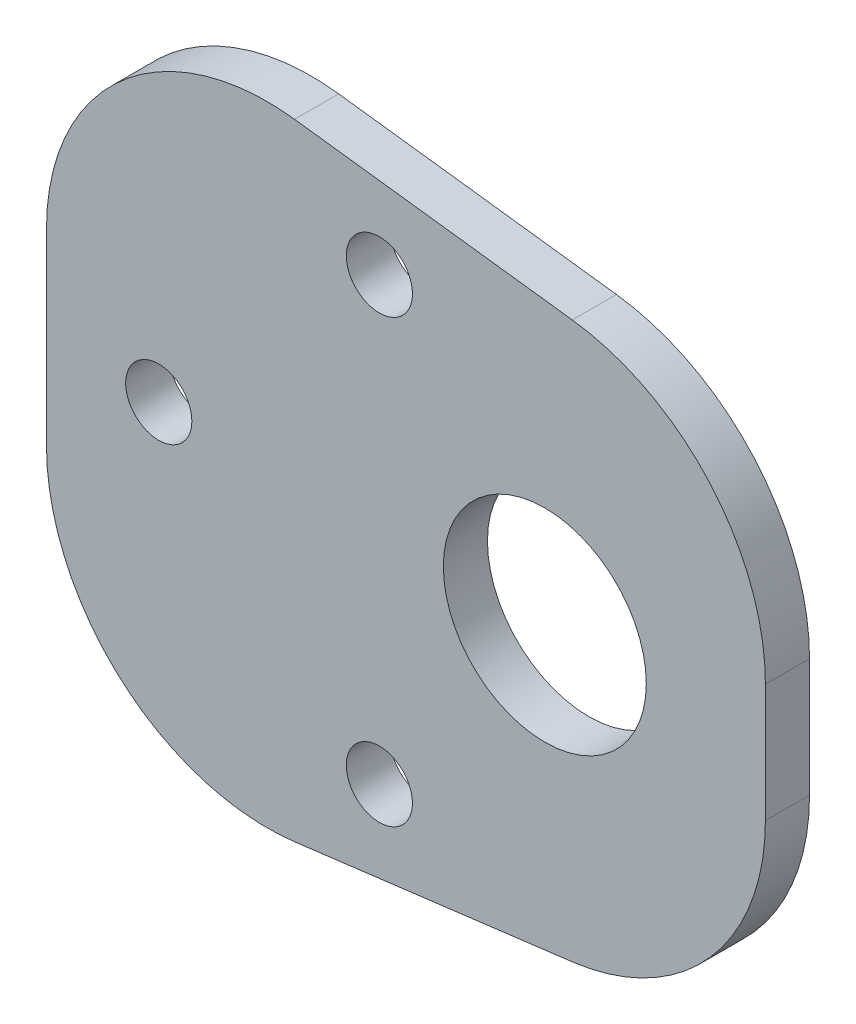
ISO-10303-21;
HEADER;
FILE_DESCRIPTION(('STEP AP214'),'2;1');
FILE_NAME('part.step','',(''),(''),'','','');
FILE_SCHEMA(('AUTOMOTIVE_DESIGN { 1 0 10303 214 1 1 1 1 }'));
ENDSEC;
DATA;
#1=APPLICATION_CONTEXT('core data for automotive mechanical design processes');
#2=APPLICATION_PROTOCOL_DEFINITION('international standard','automotive_design',2000,#1);
#3=PRODUCT_CONTEXT('',#1,'mechanical');
#4=PRODUCT('Part','Part','',(#3));
#5=PRODUCT_RELATED_PRODUCT_CATEGORY('part','',(#4));
#6=PRODUCT_DEFINITION_FORMATION('','',#4);
#7=PRODUCT_DEFINITION_CONTEXT('part definition',#1,'design');
#8=PRODUCT_DEFINITION('design','',#6,#7);
#9=PRODUCT_DEFINITION_SHAPE('','',#8);
#10=(LENGTH_UNIT() NAMED_UNIT(*) SI_UNIT(.MILLI.,.METRE.));
#11=(NAMED_UNIT(*) PLANE_ANGLE_UNIT() SI_UNIT($,.RADIAN.));
#12=(NAMED_UNIT(*) SI_UNIT($,.STERADIAN.) SOLID_ANGLE_UNIT());
#13=UNCERTAINTY_MEASURE_WITH_UNIT(LENGTH_MEASURE(1.E-05),#10,'distance_accuracy_value','');
#14=(GEOMETRIC_REPRESENTATION_CONTEXT(3) GLOBAL_UNCERTAINTY_ASSIGNED_CONTEXT((#13)) GLOBAL_UNIT_ASSIGNED_CONTEXT((#10,
#11,#12)) REPRESENTATION_CONTEXT('',''));
#15=CARTESIAN_POINT('',(0.,0.,0.));
#16=DIRECTION('',(0.,0.,1.));
#17=DIRECTION('',(1.,0.,0.));
#18=AXIS2_PLACEMENT_3D('',#15,#16,#17);
#19=CARTESIAN_POINT('',(-27.5892088648675,0.,2.));
#20=DIRECTION('',(-1.,0.,0.));
#21=DIRECTION('',(0.,0.,1.));
#22=AXIS2_PLACEMENT_3D('',#19,#20,#21);
#23=PLANE('',#22);
#24=DIRECTION('',(0.,1.,0.));
#25=VECTOR('',#24,1.);
#26=CARTESIAN_POINT('',(-27.5892088648675,0.,0.));
#27=LINE('',#26,#25);
#28=CARTESIAN_POINT('',(-27.5892088648675,-4.25908894153826,0.));
#29=VERTEX_POINT('',#28);
#30=CARTESIAN_POINT('',(-27.5892088648675,4.25908894153826,0.));
#31=VERTEX_POINT('',#30);
#32=EDGE_CURVE('E147',#29,#31,#27,.T.);
#33=ORIENTED_EDGE('',*,*,#32,.F.);
#34=DIRECTION('',(0.,0.,-1.));
#35=VECTOR('',#34,1.);
#36=CARTESIAN_POINT('',(-27.5892088648675,-4.25908894153826,2.));
#37=LINE('',#36,#35);
#38=CARTESIAN_POINT('',(-27.5892088648675,-4.25908894153826,2.));
#39=VERTEX_POINT('',#38);
#40=EDGE_CURVE('E11',#39,#29,#37,.T.);
#41=ORIENTED_EDGE('',*,*,#40,.F.);
#42=DIRECTION('',(0.,1.,0.));
#43=VECTOR('',#42,1.);
#44=CARTESIAN_POINT('',(-27.5892088648675,0.,2.));
#45=LINE('',#44,#43);
#46=CARTESIAN_POINT('',(-27.5892088648675,4.25908894153826,2.));
#47=VERTEX_POINT('',#46);
#48=EDGE_CURVE('E191',#39,#47,#45,.T.);
#49=ORIENTED_EDGE('',*,*,#48,.T.);
#50=DIRECTION('',(0.,0.,-1.));
#51=VECTOR('',#50,1.);
#52=CARTESIAN_POINT('',(-27.5892088648675,4.25908894153826,2.));
#53=LINE('',#52,#51);
#54=EDGE_CURVE('E89',#47,#31,#53,.T.);
#55=ORIENTED_EDGE('',*,*,#54,.T.);
#56=EDGE_LOOP('',(#33,#41,#49,#55));
#57=FACE_BOUND('',#56,.T.);
#58=ADVANCED_FACE('F37',(#57),#23,.T.);
#59=CARTESIAN_POINT('',(-17.5892088648675,-4.25908894153834,2.));
#60=DIRECTION('',(0.,0.,-1.));
#61=DIRECTION('',(-1.,0.,0.));
#62=AXIS2_PLACEMENT_3D('',#59,#60,#61);
#63=CYLINDRICAL_SURFACE('',#62,10.);
#64=CARTESIAN_POINT('',(-17.5892088648675,-4.25908894153834,0.));
#65=DIRECTION('',(0.,0.,1.));
#66=DIRECTION('',(1.,0.,0.));
#67=AXIS2_PLACEMENT_3D('',#64,#65,#66);
#68=CIRCLE('',#67,10.);
#69=CARTESIAN_POINT('',(-16.3433106435309,-14.1811722722744,0.));
#70=VERTEX_POINT('',#69);
#71=EDGE_CURVE('E149',#29,#70,#68,.T.);
#72=ORIENTED_EDGE('',*,*,#71,.T.);
#73=DIRECTION('',(0.,0.,-1.));
#74=VECTOR('',#73,1.);
#75=CARTESIAN_POINT('',(-16.3433106435309,-14.1811722722744,2.));
#76=LINE('',#75,#74);
#77=CARTESIAN_POINT('',(-16.3433106435309,-14.1811722722744,2.));
#78=VERTEX_POINT('',#77);
#79=EDGE_CURVE('E46',#78,#70,#76,.T.);
#80=ORIENTED_EDGE('',*,*,#79,.F.);
#81=CARTESIAN_POINT('',(-17.5892088648675,-4.25908894153834,2.));
#82=DIRECTION('',(0.,0.,1.));
#83=DIRECTION('',(1.,0.,0.));
#84=AXIS2_PLACEMENT_3D('',#81,#82,#83);
#85=CIRCLE('',#84,10.);
#86=EDGE_CURVE('E189',#39,#78,#85,.T.);
#87=ORIENTED_EDGE('',*,*,#86,.F.);
#88=ORIENTED_EDGE('',*,*,#40,.T.);
#89=EDGE_LOOP('',(#72,#80,#87,#88));
#90=FACE_BOUND('',#89,.T.);
#91=ADVANCED_FACE('F181',(#90),#63,.T.);
#92=CARTESIAN_POINT('',(1.49937211984162,-11.9406985755969,2.));
#93=DIRECTION('',(0.124589822133646,-0.992208333073607,0.));
#94=DIRECTION('',(0.992208333073607,0.124589822133646,0.));
#95=AXIS2_PLACEMENT_3D('',#92,#93,#94);
#96=PLANE('',#95);
#97=DIRECTION('',(-0.992208333073607,-0.124589822133646,0.));
#98=VECTOR('',#97,1.);
#99=CARTESIAN_POINT('',(1.49937211984162,-11.9406985755969,0.));
#100=LINE('',#99,#98);
#101=CARTESIAN_POINT('',(-3.75309694701218,-12.6002417027692,0.));
#102=VERTEX_POINT('',#101);
#103=EDGE_CURVE('E152',#102,#70,#100,.T.);
#104=ORIENTED_EDGE('',*,*,#103,.F.);
#105=DIRECTION('',(0.,0.,-1.));
#106=VECTOR('',#105,1.);
#107=CARTESIAN_POINT('',(-3.75309694701218,-12.6002417027692,2.));
#108=LINE('',#107,#106);
#109=CARTESIAN_POINT('',(-3.75309694701218,-12.6002417027692,2.));
#110=VERTEX_POINT('',#109);
#111=EDGE_CURVE('E171',#110,#102,#108,.T.);
#112=ORIENTED_EDGE('',*,*,#111,.F.);
#113=DIRECTION('',(-0.992208333073607,-0.124589822133646,0.));
#114=VECTOR('',#113,1.);
#115=CARTESIAN_POINT('',(1.49937211984162,-11.9406985755969,2.));
#116=LINE('',#115,#114);
#117=EDGE_CURVE('E178',#110,#78,#116,.T.);
#118=ORIENTED_EDGE('',*,*,#117,.T.);
#119=ORIENTED_EDGE('',*,*,#79,.T.);
#120=EDGE_LOOP('',(#104,#112,#118,#119));
#121=FACE_BOUND('',#120,.T.);
#122=ADVANCED_FACE('F176',(#121),#96,.T.);
#123=CARTESIAN_POINT('',(-4.99899516834858,-2.67815837203311,2.));
#124=DIRECTION('',(0.,0.,-1.));
#125=DIRECTION('',(-1.,0.,0.));
#126=AXIS2_PLACEMENT_3D('',#123,#124,#125);
#127=CYLINDRICAL_SURFACE('',#126,10.);
#128=CARTESIAN_POINT('',(-4.99899516834858,-2.67815837203311,0.));
#129=DIRECTION('',(0.,0.,1.));
#130=DIRECTION('',(1.,0.,0.));
#131=AXIS2_PLACEMENT_3D('',#128,#129,#130);
#132=CIRCLE('',#131,10.);
#133=CARTESIAN_POINT('',(5.00100483165142,-2.67815837203305,0.));
#134=VERTEX_POINT('',#133);
#135=EDGE_CURVE('E155',#102,#134,#132,.T.);
#136=ORIENTED_EDGE('',*,*,#135,.T.);
#137=DIRECTION('',(0.,0.,-1.));
#138=VECTOR('',#137,1.);
#139=CARTESIAN_POINT('',(5.00100483165142,-2.67815837203305,2.));
#140=LINE('',#139,#138);
#141=CARTESIAN_POINT('',(5.00100483165142,-2.67815837203305,2.));
#142=VERTEX_POINT('',#141);
#143=EDGE_CURVE('E169',#142,#134,#140,.T.);
#144=ORIENTED_EDGE('',*,*,#143,.F.);
#145=CARTESIAN_POINT('',(-4.99899516834858,-2.67815837203311,2.));
#146=DIRECTION('',(0.,0.,1.));
#147=DIRECTION('',(1.,0.,0.));
#148=AXIS2_PLACEMENT_3D('',#145,#146,#147);
#149=CIRCLE('',#148,10.);
#150=EDGE_CURVE('E130',#110,#142,#149,.T.);
#151=ORIENTED_EDGE('',*,*,#150,.F.);
#152=ORIENTED_EDGE('',*,*,#111,.T.);
#153=EDGE_LOOP('',(#136,#144,#151,#152));
#154=FACE_BOUND('',#153,.T.);
#155=ADVANCED_FACE('F187',(#154),#127,.T.);
#156=CARTESIAN_POINT('',(5.00100483165142,0.,2.));
#157=DIRECTION('',(1.,0.,0.));
#158=DIRECTION('',(0.,0.,-1.));
#159=AXIS2_PLACEMENT_3D('',#156,#157,#158);
#160=PLANE('',#159);
#161=DIRECTION('',(0.,-1.,0.));
#162=VECTOR('',#161,1.);
#163=CARTESIAN_POINT('',(5.00100483165142,0.,0.));
#164=LINE('',#163,#162);
#165=CARTESIAN_POINT('',(5.00100483165142,2.67815837203305,0.));
#166=VERTEX_POINT('',#165);
#167=EDGE_CURVE('E158',#166,#134,#164,.T.);
#168=ORIENTED_EDGE('',*,*,#167,.F.);
#169=DIRECTION('',(0.,0.,-1.));
#170=VECTOR('',#169,1.);
#171=CARTESIAN_POINT('',(5.00100483165142,2.67815837203305,2.));
#172=LINE('',#171,#170);
#173=CARTESIAN_POINT('',(5.00100483165142,2.67815837203305,2.));
#174=VERTEX_POINT('',#173);
#175=EDGE_CURVE('E118',#174,#166,#172,.T.);
#176=ORIENTED_EDGE('',*,*,#175,.F.);
#177=DIRECTION('',(0.,-1.,0.));
#178=VECTOR('',#177,1.);
#179=CARTESIAN_POINT('',(5.00100483165142,0.,2.));
#180=LINE('',#179,#178);
#181=EDGE_CURVE('E128',#174,#142,#180,.T.);
#182=ORIENTED_EDGE('',*,*,#181,.T.);
#183=ORIENTED_EDGE('',*,*,#143,.T.);
#184=EDGE_LOOP('',(#168,#176,#182,#183));
#185=FACE_BOUND('',#184,.T.);
#186=ADVANCED_FACE('F265',(#185),#160,.T.);
#187=CARTESIAN_POINT('',(-4.99899516834858,2.67815837203311,2.));
#188=DIRECTION('',(0.,0.,-1.));
#189=DIRECTION('',(-1.,0.,0.));
#190=AXIS2_PLACEMENT_3D('',#187,#188,#189);
#191=CYLINDRICAL_SURFACE('',#190,10.);
#192=CARTESIAN_POINT('',(-4.99899516834858,2.67815837203311,0.));
#193=DIRECTION('',(0.,0.,1.));
#194=DIRECTION('',(1.,0.,0.));
#195=AXIS2_PLACEMENT_3D('',#192,#193,#194);
#196=CIRCLE('',#195,10.);
#197=CARTESIAN_POINT('',(-3.75309694701218,12.6002417027692,0.));
#198=VERTEX_POINT('',#197);
#199=EDGE_CURVE('E115',#198,#166,#196,.F.);
#200=ORIENTED_EDGE('',*,*,#199,.F.);
#201=DIRECTION('',(0.,0.,-1.));
#202=VECTOR('',#201,1.);
#203=CARTESIAN_POINT('',(-3.75309694701218,12.6002417027692,2.));
#204=LINE('',#203,#202);
#205=CARTESIAN_POINT('',(-3.75309694701218,12.6002417027692,2.));
#206=VERTEX_POINT('',#205);
#207=EDGE_CURVE('E109',#206,#198,#204,.T.);
#208=ORIENTED_EDGE('',*,*,#207,.F.);
#209=CARTESIAN_POINT('',(-4.99899516834858,2.67815837203311,2.));
#210=DIRECTION('',(0.,0.,1.));
#211=DIRECTION('',(1.,0.,0.));
#212=AXIS2_PLACEMENT_3D('',#209,#210,#211);
#213=CIRCLE('',#212,10.);
#214=EDGE_CURVE('E113',#206,#174,#213,.F.);
#215=ORIENTED_EDGE('',*,*,#214,.T.);
#216=ORIENTED_EDGE('',*,*,#175,.T.);
#217=EDGE_LOOP('',(#200,#208,#215,#216));
#218=FACE_BOUND('',#217,.T.);
#219=ADVANCED_FACE('F111',(#218),#191,.T.);
#220=CARTESIAN_POINT('',(1.49937211984162,11.9406985755969,2.));
#221=DIRECTION('',(-0.124589822133646,-0.992208333073607,0.));
#222=DIRECTION('',(0.992208333073607,-0.124589822133646,0.));
#223=AXIS2_PLACEMENT_3D('',#220,#221,#222);
#224=PLANE('',#223);
#225=DIRECTION('',(-0.992208333073607,0.124589822133646,0.));
#226=VECTOR('',#225,1.);
#227=CARTESIAN_POINT('',(1.49937211984162,11.9406985755969,0.));
#228=LINE('',#227,#226);
#229=CARTESIAN_POINT('',(-16.3433106435309,14.1811722722744,0.));
#230=VERTEX_POINT('',#229);
#231=EDGE_CURVE('E162',#198,#230,#228,.T.);
#232=ORIENTED_EDGE('',*,*,#231,.T.);
#233=DIRECTION('',(0.,0.,-1.));
#234=VECTOR('',#233,1.);
#235=CARTESIAN_POINT('',(-16.3433106435309,14.1811722722744,2.));
#236=LINE('',#235,#234);
#237=CARTESIAN_POINT('',(-16.3433106435309,14.1811722722744,2.));
#238=VERTEX_POINT('',#237);
#239=EDGE_CURVE('E119',#238,#230,#236,.T.);
#240=ORIENTED_EDGE('',*,*,#239,.F.);
#241=DIRECTION('',(-0.992208333073607,0.124589822133646,0.));
#242=VECTOR('',#241,1.);
#243=CARTESIAN_POINT('',(1.49937211984162,11.9406985755969,2.));
#244=LINE('',#243,#242);
#245=EDGE_CURVE('E122',#206,#238,#244,.T.);
#246=ORIENTED_EDGE('',*,*,#245,.F.);
#247=ORIENTED_EDGE('',*,*,#207,.T.);
#248=EDGE_LOOP('',(#232,#240,#246,#247));
#249=FACE_BOUND('',#248,.T.);
#250=ADVANCED_FACE('F123',(#249),#224,.F.);
#251=CARTESIAN_POINT('',(-22.4989951683486,0.,2.));
#252=DIRECTION('',(0.,0.,-1.));
#253=DIRECTION('',(-1.,0.,0.));
#254=AXIS2_PLACEMENT_3D('',#251,#252,#253);
#255=CYLINDRICAL_SURFACE('',#254,1.5);
#256=CARTESIAN_POINT('',(-22.4989951683486,0.,2.));
#257=DIRECTION('',(0.,0.,1.));
#258=DIRECTION('',(1.,0.,0.));
#259=AXIS2_PLACEMENT_3D('',#256,#257,#258);
#260=CIRCLE('',#259,1.5);
#261=CARTESIAN_POINT('',(-20.9989951683486,0.,2.));
#262=VERTEX_POINT('',#261);
#263=EDGE_CURVE('E195',#262,#262,#260,.T.);
#264=ORIENTED_EDGE('',*,*,#263,.T.);
#265=EDGE_LOOP('',(#264));
#266=FACE_BOUND('',#265,.T.);
#267=CARTESIAN_POINT('',(-22.4989951683486,0.,0.));
#268=DIRECTION('',(0.,0.,1.));
#269=DIRECTION('',(1.,0.,0.));
#270=AXIS2_PLACEMENT_3D('',#267,#268,#269);
#271=CIRCLE('',#270,1.5);
#272=CARTESIAN_POINT('',(-20.9989951683486,0.,0.));
#273=VERTEX_POINT('',#272);
#274=EDGE_CURVE('E144',#273,#273,#271,.T.);
#275=ORIENTED_EDGE('',*,*,#274,.F.);
#276=EDGE_LOOP('',(#275));
#277=FACE_BOUND('',#276,.T.);
#278=ADVANCED_FACE('F219',(#266,#277),#255,.F.);
#279=CARTESIAN_POINT('',(-12.4989951683486,-10.,2.));
#280=DIRECTION('',(0.,0.,-1.));
#281=DIRECTION('',(-1.,0.,0.));
#282=AXIS2_PLACEMENT_3D('',#279,#280,#281);
#283=CYLINDRICAL_SURFACE('',#282,1.5);
#284=CARTESIAN_POINT('',(-12.4989951683486,-10.,2.));
#285=DIRECTION('',(0.,0.,1.));
#286=DIRECTION('',(1.,0.,0.));
#287=AXIS2_PLACEMENT_3D('',#284,#285,#286);
#288=CIRCLE('',#287,1.5);
#289=CARTESIAN_POINT('',(-10.9989951683486,-10.,2.));
#290=VERTEX_POINT('',#289);
#291=EDGE_CURVE('E198',#290,#290,#288,.T.);
#292=ORIENTED_EDGE('',*,*,#291,.T.);
#293=EDGE_LOOP('',(#292));
#294=FACE_BOUND('',#293,.T.);
#295=CARTESIAN_POINT('',(-12.4989951683486,-10.,0.));
#296=DIRECTION('',(0.,0.,1.));
#297=DIRECTION('',(1.,0.,0.));
#298=AXIS2_PLACEMENT_3D('',#295,#296,#297);
#299=CIRCLE('',#298,1.5);
#300=CARTESIAN_POINT('',(-10.9989951683486,-10.,0.));
#301=VERTEX_POINT('',#300);
#302=EDGE_CURVE('E141',#301,#301,#299,.T.);
#303=ORIENTED_EDGE('',*,*,#302,.F.);
#304=EDGE_LOOP('',(#303));
#305=FACE_BOUND('',#304,.T.);
#306=ADVANCED_FACE('F222',(#294,#305),#283,.F.);
#307=CARTESIAN_POINT('',(-4.99899516834858,0.,2.));
#308=DIRECTION('',(0.,0.,-1.));
#309=DIRECTION('',(-1.,0.,0.));
#310=AXIS2_PLACEMENT_3D('',#307,#308,#309);
#311=CYLINDRICAL_SURFACE('',#310,4.6);
#312=CARTESIAN_POINT('',(-4.99899516834858,0.,2.));
#313=DIRECTION('',(0.,0.,1.));
#314=DIRECTION('',(1.,0.,0.));
#315=AXIS2_PLACEMENT_3D('',#312,#313,#314);
#316=CIRCLE('',#315,4.6);
#317=CARTESIAN_POINT('',(-0.398995168348585,0.,2.));
#318=VERTEX_POINT('',#317);
#319=EDGE_CURVE('E201',#318,#318,#316,.T.);
#320=ORIENTED_EDGE('',*,*,#319,.T.);
#321=EDGE_LOOP('',(#320));
#322=FACE_BOUND('',#321,.T.);
#323=CARTESIAN_POINT('',(-4.99899516834858,0.,0.));
#324=DIRECTION('',(0.,0.,1.));
#325=DIRECTION('',(1.,0.,0.));
#326=AXIS2_PLACEMENT_3D('',#323,#324,#325);
#327=CIRCLE('',#326,4.6);
#328=CARTESIAN_POINT('',(-0.398995168348585,0.,0.));
#329=VERTEX_POINT('',#328);
#330=EDGE_CURVE('E138',#329,#329,#327,.T.);
#331=ORIENTED_EDGE('',*,*,#330,.F.);
#332=EDGE_LOOP('',(#331));
#333=FACE_BOUND('',#332,.T.);
#334=ADVANCED_FACE('F242',(#322,#333),#311,.F.);
#335=CARTESIAN_POINT('',(-12.4989951683486,10.,2.));
#336=DIRECTION('',(0.,0.,-1.));
#337=DIRECTION('',(-1.,0.,0.));
#338=AXIS2_PLACEMENT_3D('',#335,#336,#337);
#339=CYLINDRICAL_SURFACE('',#338,1.5);
#340=CARTESIAN_POINT('',(-12.4989951683486,10.,2.));
#341=DIRECTION('',(0.,0.,1.));
#342=DIRECTION('',(1.,0.,0.));
#343=AXIS2_PLACEMENT_3D('',#340,#341,#342);
#344=CIRCLE('',#343,1.5);
#345=CARTESIAN_POINT('',(-10.9989951683486,10.,2.));
#346=VERTEX_POINT('',#345);
#347=EDGE_CURVE('E165',#346,#346,#344,.T.);
#348=ORIENTED_EDGE('',*,*,#347,.T.);
#349=EDGE_LOOP('',(#348));
#350=FACE_BOUND('',#349,.T.);
#351=CARTESIAN_POINT('',(-12.4989951683486,10.,0.));
#352=DIRECTION('',(0.,0.,1.));
#353=DIRECTION('',(1.,0.,0.));
#354=AXIS2_PLACEMENT_3D('',#351,#352,#353);
#355=CIRCLE('',#354,1.5);
#356=CARTESIAN_POINT('',(-10.9989951683486,10.,0.));
#357=VERTEX_POINT('',#356);
#358=EDGE_CURVE('E135',#357,#357,#355,.T.);
#359=ORIENTED_EDGE('',*,*,#358,.F.);
#360=EDGE_LOOP('',(#359));
#361=FACE_BOUND('',#360,.T.);
#362=ADVANCED_FACE('F39',(#350,#361),#339,.F.);
#363=CARTESIAN_POINT('',(-17.5892088648675,4.25908894153834,2.));
#364=DIRECTION('',(0.,0.,-1.));
#365=DIRECTION('',(-1.,0.,0.));
#366=AXIS2_PLACEMENT_3D('',#363,#364,#365);
#367=CYLINDRICAL_SURFACE('',#366,10.);
#368=CARTESIAN_POINT('',(-17.5892088648675,4.25908894153834,0.));
#369=DIRECTION('',(0.,0.,1.));
#370=DIRECTION('',(1.,0.,0.));
#371=AXIS2_PLACEMENT_3D('',#368,#369,#370);
#372=CIRCLE('',#371,10.);
#373=EDGE_CURVE('E82',#230,#31,#372,.T.);
#374=ORIENTED_EDGE('',*,*,#373,.T.);
#375=ORIENTED_EDGE('',*,*,#54,.F.);
#376=CARTESIAN_POINT('',(-17.5892088648675,4.25908894153834,2.));
#377=DIRECTION('',(0.,0.,1.));
#378=DIRECTION('',(1.,0.,0.));
#379=AXIS2_PLACEMENT_3D('',#376,#377,#378);
#380=CIRCLE('',#379,10.);
#381=EDGE_CURVE('E54',#238,#47,#380,.T.);
#382=ORIENTED_EDGE('',*,*,#381,.F.);
#383=ORIENTED_EDGE('',*,*,#239,.T.);
#384=EDGE_LOOP('',(#374,#375,#382,#383));
#385=FACE_BOUND('',#384,.T.);
#386=ADVANCED_FACE('F211',(#385),#367,.T.);
#387=CARTESIAN_POINT('',(0.,0.,2.));
#388=DIRECTION('',(0.,0.,1.));
#389=DIRECTION('',(1.,0.,0.));
#390=AXIS2_PLACEMENT_3D('',#387,#388,#389);
#391=PLANE('',#390);
#392=ORIENTED_EDGE('',*,*,#347,.F.);
#393=EDGE_LOOP('',(#392));
#394=FACE_BOUND('',#393,.T.);
#395=ORIENTED_EDGE('',*,*,#319,.F.);
#396=EDGE_LOOP('',(#395));
#397=FACE_BOUND('',#396,.T.);
#398=ORIENTED_EDGE('',*,*,#291,.F.);
#399=EDGE_LOOP('',(#398));
#400=FACE_BOUND('',#399,.T.);
#401=ORIENTED_EDGE('',*,*,#263,.F.);
#402=EDGE_LOOP('',(#401));
#403=FACE_BOUND('',#402,.T.);
#404=ORIENTED_EDGE('',*,*,#48,.F.);
#405=ORIENTED_EDGE('',*,*,#86,.T.);
#406=ORIENTED_EDGE('',*,*,#117,.F.);
#407=ORIENTED_EDGE('',*,*,#150,.T.);
#408=ORIENTED_EDGE('',*,*,#181,.F.);
#409=ORIENTED_EDGE('',*,*,#214,.F.);
#410=ORIENTED_EDGE('',*,*,#245,.T.);
#411=ORIENTED_EDGE('',*,*,#381,.T.);
#412=EDGE_LOOP('',(#404,#405,#406,#407,#408,#409,#410,#411));
#413=FACE_BOUND('',#412,.T.);
#414=ADVANCED_FACE('F126',(#394,#397,#400,#403,#413),#391,.T.);
#415=CARTESIAN_POINT('',(0.,0.,0.));
#416=DIRECTION('',(0.,0.,1.));
#417=DIRECTION('',(1.,0.,0.));
#418=AXIS2_PLACEMENT_3D('',#415,#416,#417);
#419=PLANE('',#418);
#420=ORIENTED_EDGE('',*,*,#358,.T.);
#421=EDGE_LOOP('',(#420));
#422=FACE_BOUND('',#421,.T.);
#423=ORIENTED_EDGE('',*,*,#330,.T.);
#424=EDGE_LOOP('',(#423));
#425=FACE_BOUND('',#424,.T.);
#426=ORIENTED_EDGE('',*,*,#302,.T.);
#427=EDGE_LOOP('',(#426));
#428=FACE_BOUND('',#427,.T.);
#429=ORIENTED_EDGE('',*,*,#274,.T.);
#430=EDGE_LOOP('',(#429));
#431=FACE_BOUND('',#430,.T.);
#432=ORIENTED_EDGE('',*,*,#32,.T.);
#433=ORIENTED_EDGE('',*,*,#373,.F.);
#434=ORIENTED_EDGE('',*,*,#231,.F.);
#435=ORIENTED_EDGE('',*,*,#199,.T.);
#436=ORIENTED_EDGE('',*,*,#167,.T.);
#437=ORIENTED_EDGE('',*,*,#135,.F.);
#438=ORIENTED_EDGE('',*,*,#103,.T.);
#439=ORIENTED_EDGE('',*,*,#71,.F.);
#440=EDGE_LOOP('',(#432,#433,#434,#435,#436,#437,#438,#439));
#441=FACE_BOUND('',#440,.T.);
#442=ADVANCED_FACE('F183',(#422,#425,#428,#431,#441),#419,.F.);
#443=CLOSED_SHELL('',(#58,#91,#122,#155,#186,#219,#250,#278,#306,#334,#362,#386,#414,#442));
#444=MANIFOLD_SOLID_BREP('B2',#443);
#445=ADVANCED_BREP_SHAPE_REPRESENTATION('',(#18,#444),#14);
#446=SHAPE_DEFINITION_REPRESENTATION(#9,#445);
ENDSEC;
END-ISO-10303-21;
